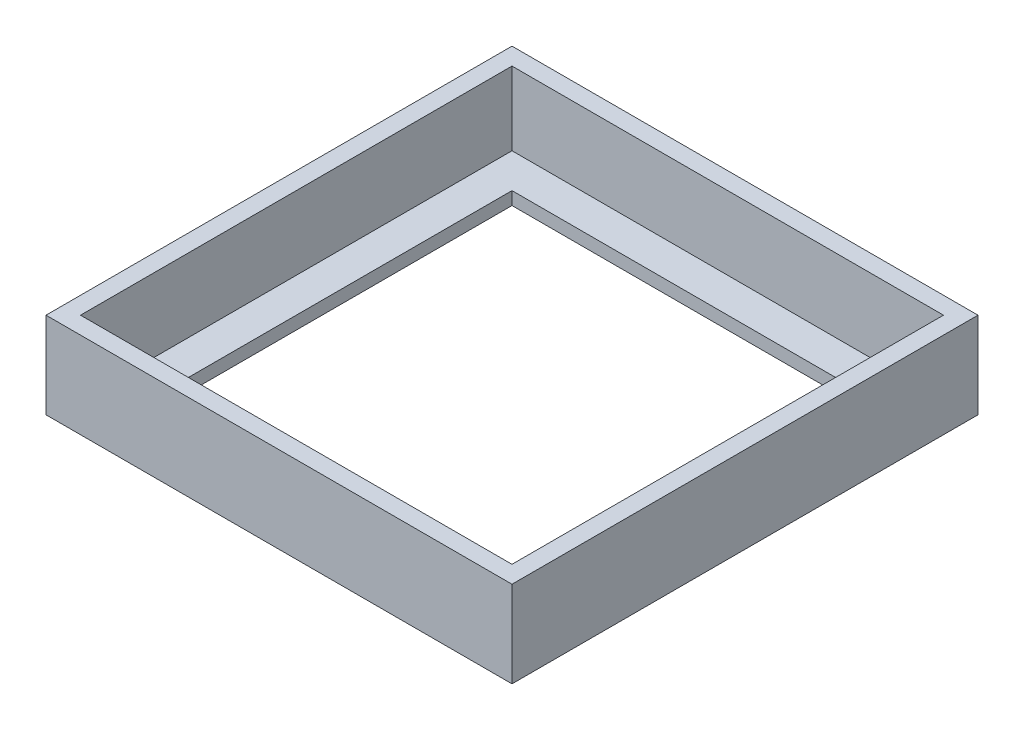
ISO-10303-21;
HEADER;
FILE_DESCRIPTION(('STEP AP214'),'2;1');
FILE_NAME('part.step','',(''),(''),'','','');
FILE_SCHEMA(('AUTOMOTIVE_DESIGN { 1 0 10303 214 1 1 1 1 }'));
ENDSEC;
DATA;
#1=APPLICATION_CONTEXT('core data for automotive mechanical design processes');
#2=APPLICATION_PROTOCOL_DEFINITION('international standard','automotive_design',2000,#1);
#3=PRODUCT_CONTEXT('',#1,'mechanical');
#4=PRODUCT('Part','Part','',(#3));
#5=PRODUCT_RELATED_PRODUCT_CATEGORY('part','',(#4));
#6=PRODUCT_DEFINITION_FORMATION('','',#4);
#7=PRODUCT_DEFINITION_CONTEXT('part definition',#1,'design');
#8=PRODUCT_DEFINITION('design','',#6,#7);
#9=PRODUCT_DEFINITION_SHAPE('','',#8);
#10=(LENGTH_UNIT() NAMED_UNIT(*) SI_UNIT(.MILLI.,.METRE.));
#11=(NAMED_UNIT(*) PLANE_ANGLE_UNIT() SI_UNIT($,.RADIAN.));
#12=(NAMED_UNIT(*) SI_UNIT($,.STERADIAN.) SOLID_ANGLE_UNIT());
#13=UNCERTAINTY_MEASURE_WITH_UNIT(LENGTH_MEASURE(1.E-05),#10,'distance_accuracy_value','');
#14=(GEOMETRIC_REPRESENTATION_CONTEXT(3) GLOBAL_UNCERTAINTY_ASSIGNED_CONTEXT((#13)) GLOBAL_UNIT_ASSIGNED_CONTEXT((#10,
#11,#12)) REPRESENTATION_CONTEXT('',''));
#15=CARTESIAN_POINT('',(0.,0.,0.));
#16=DIRECTION('',(0.,0.,1.));
#17=DIRECTION('',(1.,0.,0.));
#18=AXIS2_PLACEMENT_3D('',#15,#16,#17);
#19=CARTESIAN_POINT('',(0.,1.5,0.));
#20=DIRECTION('',(0.,1.,0.));
#21=DIRECTION('',(0.,0.,1.));
#22=AXIS2_PLACEMENT_3D('',#19,#20,#21);
#23=PLANE('',#22);
#24=DIRECTION('',(1.,0.,0.));
#25=VECTOR('',#24,1.);
#26=CARTESIAN_POINT('',(-40.,1.5,-27.));
#27=LINE('',#26,#25);
#28=CARTESIAN_POINT('',(-40.,1.5,-27.));
#29=VERTEX_POINT('',#28);
#30=CARTESIAN_POINT('',(1.99999999999999,1.5,-27.));
#31=VERTEX_POINT('',#30);
#32=EDGE_CURVE('E213',#29,#31,#27,.T.);
#33=ORIENTED_EDGE('',*,*,#32,.T.);
#34=DIRECTION('',(0.,0.,1.));
#35=VECTOR('',#34,1.);
#36=CARTESIAN_POINT('',(1.99999999999999,1.5,-27.));
#37=LINE('',#36,#35);
#38=CARTESIAN_POINT('',(2.,1.5,15.));
#39=VERTEX_POINT('',#38);
#40=EDGE_CURVE('E216',#31,#39,#37,.T.);
#41=ORIENTED_EDGE('',*,*,#40,.T.);
#42=DIRECTION('',(1.,0.,0.));
#43=VECTOR('',#42,1.);
#44=CARTESIAN_POINT('',(-40.,1.5,15.));
#45=LINE('',#44,#43);
#46=CARTESIAN_POINT('',(-40.,1.5,15.));
#47=VERTEX_POINT('',#46);
#48=EDGE_CURVE('E220',#47,#39,#45,.T.);
#49=ORIENTED_EDGE('',*,*,#48,.F.);
#50=DIRECTION('',(0.,0.,1.));
#51=VECTOR('',#50,1.);
#52=CARTESIAN_POINT('',(-40.,1.5,-27.));
#53=LINE('',#52,#51);
#54=EDGE_CURVE('E222',#29,#47,#53,.T.);
#55=ORIENTED_EDGE('',*,*,#54,.F.);
#56=EDGE_LOOP('',(#33,#41,#49,#55));
#57=FACE_BOUND('',#56,.T.);
#58=DIRECTION('',(0.,0.,1.));
#59=VECTOR('',#58,1.);
#60=CARTESIAN_POINT('',(6.,1.5,0.));
#61=LINE('',#60,#59);
#62=CARTESIAN_POINT('',(5.99999999999999,1.5,-31.));
#63=VERTEX_POINT('',#62);
#64=CARTESIAN_POINT('',(6.,1.5,19.));
#65=VERTEX_POINT('',#64);
#66=EDGE_CURVE('E235',#63,#65,#61,.T.);
#67=ORIENTED_EDGE('',*,*,#66,.F.);
#68=DIRECTION('',(1.,0.,0.));
#69=VECTOR('',#68,1.);
#70=CARTESIAN_POINT('',(0.,1.5,-31.));
#71=LINE('',#70,#69);
#72=CARTESIAN_POINT('',(-44.,1.5,-31.));
#73=VERTEX_POINT('',#72);
#74=EDGE_CURVE('E241',#73,#63,#71,.T.);
#75=ORIENTED_EDGE('',*,*,#74,.F.);
#76=DIRECTION('',(0.,0.,1.));
#77=VECTOR('',#76,1.);
#78=CARTESIAN_POINT('',(-44.,1.5,0.));
#79=LINE('',#78,#77);
#80=CARTESIAN_POINT('',(-44.,1.5,19.));
#81=VERTEX_POINT('',#80);
#82=EDGE_CURVE('E67',#73,#81,#79,.T.);
#83=ORIENTED_EDGE('',*,*,#82,.T.);
#84=DIRECTION('',(1.,0.,0.));
#85=VECTOR('',#84,1.);
#86=CARTESIAN_POINT('',(0.,1.5,19.));
#87=LINE('',#86,#85);
#88=EDGE_CURVE('E12',#81,#65,#87,.T.);
#89=ORIENTED_EDGE('',*,*,#88,.T.);
#90=EDGE_LOOP('',(#67,#75,#83,#89));
#91=FACE_BOUND('',#90,.T.);
#92=ADVANCED_FACE('F59',(#57,#91),#23,.T.);
#93=CARTESIAN_POINT('',(0.,0.,0.));
#94=DIRECTION('',(0.,1.,0.));
#95=DIRECTION('',(0.,0.,1.));
#96=AXIS2_PLACEMENT_3D('',#93,#94,#95);
#97=PLANE('',#96);
#98=DIRECTION('',(0.,0.,1.));
#99=VECTOR('',#98,1.);
#100=CARTESIAN_POINT('',(1.99999999999999,0.,-27.));
#101=LINE('',#100,#99);
#102=CARTESIAN_POINT('',(1.99999999999999,0.,-27.));
#103=VERTEX_POINT('',#102);
#104=CARTESIAN_POINT('',(2.,0.,15.));
#105=VERTEX_POINT('',#104);
#106=EDGE_CURVE('E226',#103,#105,#101,.T.);
#107=ORIENTED_EDGE('',*,*,#106,.F.);
#108=DIRECTION('',(1.,0.,0.));
#109=VECTOR('',#108,1.);
#110=CARTESIAN_POINT('',(-40.,0.,-27.));
#111=LINE('',#110,#109);
#112=CARTESIAN_POINT('',(-40.,0.,-27.));
#113=VERTEX_POINT('',#112);
#114=EDGE_CURVE('E82',#113,#103,#111,.T.);
#115=ORIENTED_EDGE('',*,*,#114,.F.);
#116=DIRECTION('',(0.,0.,1.));
#117=VECTOR('',#116,1.);
#118=CARTESIAN_POINT('',(-40.,0.,-27.));
#119=LINE('',#118,#117);
#120=CARTESIAN_POINT('',(-40.,0.,15.));
#121=VERTEX_POINT('',#120);
#122=EDGE_CURVE('E217',#113,#121,#119,.T.);
#123=ORIENTED_EDGE('',*,*,#122,.T.);
#124=DIRECTION('',(1.,0.,0.));
#125=VECTOR('',#124,1.);
#126=CARTESIAN_POINT('',(-40.,0.,15.));
#127=LINE('',#126,#125);
#128=EDGE_CURVE('E228',#121,#105,#127,.T.);
#129=ORIENTED_EDGE('',*,*,#128,.T.);
#130=EDGE_LOOP('',(#107,#115,#123,#129));
#131=FACE_BOUND('',#130,.T.);
#132=DIRECTION('',(0.,0.,1.));
#133=VECTOR('',#132,1.);
#134=CARTESIAN_POINT('',(8.,0.,0.));
#135=LINE('',#134,#133);
#136=CARTESIAN_POINT('',(7.99999999999999,0.,-33.));
#137=VERTEX_POINT('',#136);
#138=CARTESIAN_POINT('',(8.,0.,21.));
#139=VERTEX_POINT('',#138);
#140=EDGE_CURVE('E154',#137,#139,#135,.T.);
#141=ORIENTED_EDGE('',*,*,#140,.T.);
#142=DIRECTION('',(1.,0.,0.));
#143=VECTOR('',#142,1.);
#144=CARTESIAN_POINT('',(0.,0.,21.));
#145=LINE('',#144,#143);
#146=CARTESIAN_POINT('',(-46.,0.,21.));
#147=VERTEX_POINT('',#146);
#148=EDGE_CURVE('E170',#147,#139,#145,.T.);
#149=ORIENTED_EDGE('',*,*,#148,.F.);
#150=DIRECTION('',(0.,0.,1.));
#151=VECTOR('',#150,1.);
#152=CARTESIAN_POINT('',(-46.,0.,0.));
#153=LINE('',#152,#151);
#154=CARTESIAN_POINT('',(-46.,0.,-33.));
#155=VERTEX_POINT('',#154);
#156=EDGE_CURVE('E194',#155,#147,#153,.T.);
#157=ORIENTED_EDGE('',*,*,#156,.F.);
#158=DIRECTION('',(1.,0.,0.));
#159=VECTOR('',#158,1.);
#160=CARTESIAN_POINT('',(0.,0.,-33.));
#161=LINE('',#160,#159);
#162=EDGE_CURVE('E192',#155,#137,#161,.T.);
#163=ORIENTED_EDGE('',*,*,#162,.T.);
#164=EDGE_LOOP('',(#141,#149,#157,#163));
#165=FACE_BOUND('',#164,.T.);
#166=ADVANCED_FACE('F61',(#131,#165),#97,.F.);
#167=CARTESIAN_POINT('',(-40.,1.5,-27.));
#168=DIRECTION('',(0.,0.,-1.));
#169=DIRECTION('',(-1.,0.,0.));
#170=AXIS2_PLACEMENT_3D('',#167,#168,#169);
#171=PLANE('',#170);
#172=ORIENTED_EDGE('',*,*,#114,.T.);
#173=DIRECTION('',(0.,-1.,0.));
#174=VECTOR('',#173,1.);
#175=CARTESIAN_POINT('',(1.99999999999999,1.5,-27.));
#176=LINE('',#175,#174);
#177=EDGE_CURVE('E224',#31,#103,#176,.T.);
#178=ORIENTED_EDGE('',*,*,#177,.F.);
#179=ORIENTED_EDGE('',*,*,#32,.F.);
#180=DIRECTION('',(0.,-1.,0.));
#181=VECTOR('',#180,1.);
#182=CARTESIAN_POINT('',(-40.,1.5,-27.));
#183=LINE('',#182,#181);
#184=EDGE_CURVE('E233',#29,#113,#183,.T.);
#185=ORIENTED_EDGE('',*,*,#184,.T.);
#186=EDGE_LOOP('',(#172,#178,#179,#185));
#187=FACE_BOUND('',#186,.T.);
#188=ADVANCED_FACE('F274',(#187),#171,.F.);
#189=CARTESIAN_POINT('',(-40.,1.5,-27.));
#190=DIRECTION('',(1.,0.,0.));
#191=DIRECTION('',(0.,0.,-1.));
#192=AXIS2_PLACEMENT_3D('',#189,#190,#191);
#193=PLANE('',#192);
#194=ORIENTED_EDGE('',*,*,#122,.F.);
#195=ORIENTED_EDGE('',*,*,#184,.F.);
#196=ORIENTED_EDGE('',*,*,#54,.T.);
#197=DIRECTION('',(0.,-1.,0.));
#198=VECTOR('',#197,1.);
#199=CARTESIAN_POINT('',(-40.,1.5,15.));
#200=LINE('',#199,#198);
#201=EDGE_CURVE('E236',#47,#121,#200,.T.);
#202=ORIENTED_EDGE('',*,*,#201,.T.);
#203=EDGE_LOOP('',(#194,#195,#196,#202));
#204=FACE_BOUND('',#203,.T.);
#205=ADVANCED_FACE('F279',(#204),#193,.T.);
#206=CARTESIAN_POINT('',(-40.,1.5,15.));
#207=DIRECTION('',(0.,0.,-1.));
#208=DIRECTION('',(-1.,0.,0.));
#209=AXIS2_PLACEMENT_3D('',#206,#207,#208);
#210=PLANE('',#209);
#211=ORIENTED_EDGE('',*,*,#128,.F.);
#212=ORIENTED_EDGE('',*,*,#201,.F.);
#213=ORIENTED_EDGE('',*,*,#48,.T.);
#214=DIRECTION('',(0.,-1.,0.));
#215=VECTOR('',#214,1.);
#216=CARTESIAN_POINT('',(2.,1.5,15.));
#217=LINE('',#216,#215);
#218=EDGE_CURVE('E74',#39,#105,#217,.T.);
#219=ORIENTED_EDGE('',*,*,#218,.T.);
#220=EDGE_LOOP('',(#211,#212,#213,#219));
#221=FACE_BOUND('',#220,.T.);
#222=ADVANCED_FACE('F282',(#221),#210,.T.);
#223=CARTESIAN_POINT('',(1.99999999999999,1.5,-27.));
#224=DIRECTION('',(1.,0.,0.));
#225=DIRECTION('',(0.,0.,-1.));
#226=AXIS2_PLACEMENT_3D('',#223,#224,#225);
#227=PLANE('',#226);
#228=ORIENTED_EDGE('',*,*,#106,.T.);
#229=ORIENTED_EDGE('',*,*,#218,.F.);
#230=ORIENTED_EDGE('',*,*,#40,.F.);
#231=ORIENTED_EDGE('',*,*,#177,.T.);
#232=EDGE_LOOP('',(#228,#229,#230,#231));
#233=FACE_BOUND('',#232,.T.);
#234=ADVANCED_FACE('F267',(#233),#227,.F.);
#235=CARTESIAN_POINT('',(0.,10.,-31.));
#236=DIRECTION('',(0.,0.,-1.));
#237=DIRECTION('',(-1.,0.,0.));
#238=AXIS2_PLACEMENT_3D('',#235,#236,#237);
#239=PLANE('',#238);
#240=ORIENTED_EDGE('',*,*,#74,.T.);
#241=DIRECTION('',(0.,-1.,0.));
#242=VECTOR('',#241,1.);
#243=CARTESIAN_POINT('',(5.99999999999999,10.,-31.));
#244=LINE('',#243,#242);
#245=CARTESIAN_POINT('',(5.99999999999999,10.,-31.));
#246=VERTEX_POINT('',#245);
#247=EDGE_CURVE('E205',#246,#63,#244,.T.);
#248=ORIENTED_EDGE('',*,*,#247,.F.);
#249=DIRECTION('',(1.,0.,0.));
#250=VECTOR('',#249,1.);
#251=CARTESIAN_POINT('',(0.,10.,-31.));
#252=LINE('',#251,#250);
#253=CARTESIAN_POINT('',(-44.,10.,-31.));
#254=VERTEX_POINT('',#253);
#255=EDGE_CURVE('E179',#254,#246,#252,.T.);
#256=ORIENTED_EDGE('',*,*,#255,.F.);
#257=DIRECTION('',(0.,-1.,0.));
#258=VECTOR('',#257,1.);
#259=CARTESIAN_POINT('',(-44.,10.,-31.));
#260=LINE('',#259,#258);
#261=EDGE_CURVE('E159',#254,#73,#260,.T.);
#262=ORIENTED_EDGE('',*,*,#261,.T.);
#263=EDGE_LOOP('',(#240,#248,#256,#262));
#264=FACE_BOUND('',#263,.T.);
#265=ADVANCED_FACE('F251',(#264),#239,.F.);
#266=CARTESIAN_POINT('',(6.,10.,0.));
#267=DIRECTION('',(1.,0.,0.));
#268=DIRECTION('',(0.,0.,-1.));
#269=AXIS2_PLACEMENT_3D('',#266,#267,#268);
#270=PLANE('',#269);
#271=ORIENTED_EDGE('',*,*,#66,.T.);
#272=DIRECTION('',(0.,-1.,0.));
#273=VECTOR('',#272,1.);
#274=CARTESIAN_POINT('',(6.,10.,19.));
#275=LINE('',#274,#273);
#276=CARTESIAN_POINT('',(6.,10.,19.));
#277=VERTEX_POINT('',#276);
#278=EDGE_CURVE('E202',#277,#65,#275,.T.);
#279=ORIENTED_EDGE('',*,*,#278,.F.);
#280=DIRECTION('',(0.,0.,1.));
#281=VECTOR('',#280,1.);
#282=CARTESIAN_POINT('',(6.,10.,0.));
#283=LINE('',#282,#281);
#284=EDGE_CURVE('E182',#246,#277,#283,.T.);
#285=ORIENTED_EDGE('',*,*,#284,.F.);
#286=ORIENTED_EDGE('',*,*,#247,.T.);
#287=EDGE_LOOP('',(#271,#279,#285,#286));
#288=FACE_BOUND('',#287,.T.);
#289=ADVANCED_FACE('F259',(#288),#270,.F.);
#290=CARTESIAN_POINT('',(0.,10.,19.));
#291=DIRECTION('',(0.,0.,-1.));
#292=DIRECTION('',(-1.,0.,0.));
#293=AXIS2_PLACEMENT_3D('',#290,#291,#292);
#294=PLANE('',#293);
#295=ORIENTED_EDGE('',*,*,#278,.T.);
#296=ORIENTED_EDGE('',*,*,#88,.F.);
#297=DIRECTION('',(0.,-1.,0.));
#298=VECTOR('',#297,1.);
#299=CARTESIAN_POINT('',(-44.,10.,19.));
#300=LINE('',#299,#298);
#301=CARTESIAN_POINT('',(-44.,10.,19.));
#302=VERTEX_POINT('',#301);
#303=EDGE_CURVE('E200',#302,#81,#300,.T.);
#304=ORIENTED_EDGE('',*,*,#303,.F.);
#305=DIRECTION('',(1.,0.,0.));
#306=VECTOR('',#305,1.);
#307=CARTESIAN_POINT('',(0.,10.,19.));
#308=LINE('',#307,#306);
#309=EDGE_CURVE('E184',#302,#277,#308,.T.);
#310=ORIENTED_EDGE('',*,*,#309,.T.);
#311=EDGE_LOOP('',(#295,#296,#304,#310));
#312=FACE_BOUND('',#311,.T.);
#313=ADVANCED_FACE('F257',(#312),#294,.T.);
#314=CARTESIAN_POINT('',(8.,10.,0.));
#315=DIRECTION('',(1.,0.,0.));
#316=DIRECTION('',(0.,0.,-1.));
#317=AXIS2_PLACEMENT_3D('',#314,#315,#316);
#318=PLANE('',#317);
#319=ORIENTED_EDGE('',*,*,#140,.F.);
#320=DIRECTION('',(0.,-1.,0.));
#321=VECTOR('',#320,1.);
#322=CARTESIAN_POINT('',(7.99999999999999,10.,-33.));
#323=LINE('',#322,#321);
#324=CARTESIAN_POINT('',(7.99999999999999,10.,-33.));
#325=VERTEX_POINT('',#324);
#326=EDGE_CURVE('E149',#325,#137,#323,.T.);
#327=ORIENTED_EDGE('',*,*,#326,.F.);
#328=DIRECTION('',(0.,0.,1.));
#329=VECTOR('',#328,1.);
#330=CARTESIAN_POINT('',(8.,10.,0.));
#331=LINE('',#330,#329);
#332=CARTESIAN_POINT('',(8.,10.,21.));
#333=VERTEX_POINT('',#332);
#334=EDGE_CURVE('E152',#325,#333,#331,.T.);
#335=ORIENTED_EDGE('',*,*,#334,.T.);
#336=DIRECTION('',(0.,-1.,0.));
#337=VECTOR('',#336,1.);
#338=CARTESIAN_POINT('',(8.,10.,21.));
#339=LINE('',#338,#337);
#340=EDGE_CURVE('E190',#333,#139,#339,.T.);
#341=ORIENTED_EDGE('',*,*,#340,.T.);
#342=EDGE_LOOP('',(#319,#327,#335,#341));
#343=FACE_BOUND('',#342,.T.);
#344=ADVANCED_FACE('F151',(#343),#318,.T.);
#345=CARTESIAN_POINT('',(0.,10.,-33.));
#346=DIRECTION('',(0.,0.,-1.));
#347=DIRECTION('',(-1.,0.,0.));
#348=AXIS2_PLACEMENT_3D('',#345,#346,#347);
#349=PLANE('',#348);
#350=ORIENTED_EDGE('',*,*,#162,.F.);
#351=DIRECTION('',(0.,-1.,0.));
#352=VECTOR('',#351,1.);
#353=CARTESIAN_POINT('',(-46.,10.,-33.));
#354=LINE('',#353,#352);
#355=CARTESIAN_POINT('',(-46.,10.,-33.));
#356=VERTEX_POINT('',#355);
#357=EDGE_CURVE('E160',#356,#155,#354,.T.);
#358=ORIENTED_EDGE('',*,*,#357,.F.);
#359=DIRECTION('',(1.,0.,0.));
#360=VECTOR('',#359,1.);
#361=CARTESIAN_POINT('',(0.,10.,-33.));
#362=LINE('',#361,#360);
#363=EDGE_CURVE('E166',#356,#325,#362,.T.);
#364=ORIENTED_EDGE('',*,*,#363,.T.);
#365=ORIENTED_EDGE('',*,*,#326,.T.);
#366=EDGE_LOOP('',(#350,#358,#364,#365));
#367=FACE_BOUND('',#366,.T.);
#368=ADVANCED_FACE('F172',(#367),#349,.T.);
#369=CARTESIAN_POINT('',(-46.,10.,0.));
#370=DIRECTION('',(1.,0.,0.));
#371=DIRECTION('',(0.,0.,-1.));
#372=AXIS2_PLACEMENT_3D('',#369,#370,#371);
#373=PLANE('',#372);
#374=ORIENTED_EDGE('',*,*,#156,.T.);
#375=DIRECTION('',(0.,-1.,0.));
#376=VECTOR('',#375,1.);
#377=CARTESIAN_POINT('',(-46.,10.,21.));
#378=LINE('',#377,#376);
#379=CARTESIAN_POINT('',(-46.,10.,21.));
#380=VERTEX_POINT('',#379);
#381=EDGE_CURVE('E209',#380,#147,#378,.T.);
#382=ORIENTED_EDGE('',*,*,#381,.F.);
#383=DIRECTION('',(0.,0.,1.));
#384=VECTOR('',#383,1.);
#385=CARTESIAN_POINT('',(-46.,10.,0.));
#386=LINE('',#385,#384);
#387=EDGE_CURVE('E174',#356,#380,#386,.T.);
#388=ORIENTED_EDGE('',*,*,#387,.F.);
#389=ORIENTED_EDGE('',*,*,#357,.T.);
#390=EDGE_LOOP('',(#374,#382,#388,#389));
#391=FACE_BOUND('',#390,.T.);
#392=ADVANCED_FACE('F293',(#391),#373,.F.);
#393=CARTESIAN_POINT('',(0.,10.,21.));
#394=DIRECTION('',(0.,0.,-1.));
#395=DIRECTION('',(-1.,0.,0.));
#396=AXIS2_PLACEMENT_3D('',#393,#394,#395);
#397=PLANE('',#396);
#398=ORIENTED_EDGE('',*,*,#148,.T.);
#399=ORIENTED_EDGE('',*,*,#340,.F.);
#400=DIRECTION('',(1.,0.,0.));
#401=VECTOR('',#400,1.);
#402=CARTESIAN_POINT('',(0.,10.,21.));
#403=LINE('',#402,#401);
#404=EDGE_CURVE('E168',#380,#333,#403,.T.);
#405=ORIENTED_EDGE('',*,*,#404,.F.);
#406=ORIENTED_EDGE('',*,*,#381,.T.);
#407=EDGE_LOOP('',(#398,#399,#405,#406));
#408=FACE_BOUND('',#407,.T.);
#409=ADVANCED_FACE('F296',(#408),#397,.F.);
#410=CARTESIAN_POINT('',(-44.,10.,0.));
#411=DIRECTION('',(1.,0.,0.));
#412=DIRECTION('',(0.,0.,-1.));
#413=AXIS2_PLACEMENT_3D('',#410,#411,#412);
#414=PLANE('',#413);
#415=ORIENTED_EDGE('',*,*,#303,.T.);
#416=ORIENTED_EDGE('',*,*,#82,.F.);
#417=ORIENTED_EDGE('',*,*,#261,.F.);
#418=DIRECTION('',(0.,0.,1.));
#419=VECTOR('',#418,1.);
#420=CARTESIAN_POINT('',(-44.,10.,0.));
#421=LINE('',#420,#419);
#422=EDGE_CURVE('E187',#254,#302,#421,.T.);
#423=ORIENTED_EDGE('',*,*,#422,.T.);
#424=EDGE_LOOP('',(#415,#416,#417,#423));
#425=FACE_BOUND('',#424,.T.);
#426=ADVANCED_FACE('F248',(#425),#414,.T.);
#427=CARTESIAN_POINT('',(0.,10.,0.));
#428=DIRECTION('',(0.,1.,0.));
#429=DIRECTION('',(0.,0.,1.));
#430=AXIS2_PLACEMENT_3D('',#427,#428,#429);
#431=PLANE('',#430);
#432=ORIENTED_EDGE('',*,*,#334,.F.);
#433=ORIENTED_EDGE('',*,*,#363,.F.);
#434=ORIENTED_EDGE('',*,*,#387,.T.);
#435=ORIENTED_EDGE('',*,*,#404,.T.);
#436=EDGE_LOOP('',(#432,#433,#434,#435));
#437=FACE_BOUND('',#436,.T.);
#438=ORIENTED_EDGE('',*,*,#255,.T.);
#439=ORIENTED_EDGE('',*,*,#284,.T.);
#440=ORIENTED_EDGE('',*,*,#309,.F.);
#441=ORIENTED_EDGE('',*,*,#422,.F.);
#442=EDGE_LOOP('',(#438,#439,#440,#441));
#443=FACE_BOUND('',#442,.T.);
#444=ADVANCED_FACE('F164',(#437,#443),#431,.T.);
#445=CLOSED_SHELL('',(#92,#166,#188,#205,#222,#234,#265,#289,#313,#344,#368,#392,#409,#426,#444));
#446=MANIFOLD_SOLID_BREP('B2',#445);
#447=ADVANCED_BREP_SHAPE_REPRESENTATION('',(#18,#446),#14);
#448=SHAPE_DEFINITION_REPRESENTATION(#9,#447);
ENDSEC;
END-ISO-10303-21;
